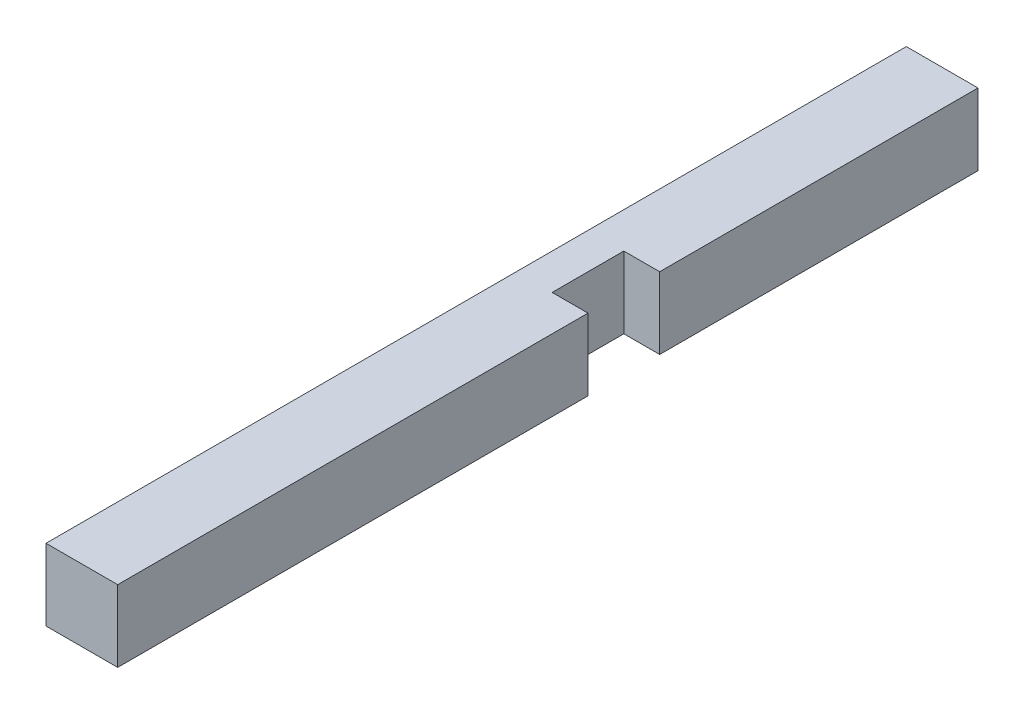
ISO-10303-21;
HEADER;
FILE_DESCRIPTION(('STEP AP214'),'2;1');
FILE_NAME('part.step','',(''),(''),'','','');
FILE_SCHEMA(('AUTOMOTIVE_DESIGN { 1 0 10303 214 1 1 1 1 }'));
ENDSEC;
DATA;
#1=APPLICATION_CONTEXT('core data for automotive mechanical design processes');
#2=APPLICATION_PROTOCOL_DEFINITION('international standard','automotive_design',2000,#1);
#3=PRODUCT_CONTEXT('',#1,'mechanical');
#4=PRODUCT('Part','Part','',(#3));
#5=PRODUCT_RELATED_PRODUCT_CATEGORY('part','',(#4));
#6=PRODUCT_DEFINITION_FORMATION('','',#4);
#7=PRODUCT_DEFINITION_CONTEXT('part definition',#1,'design');
#8=PRODUCT_DEFINITION('design','',#6,#7);
#9=PRODUCT_DEFINITION_SHAPE('','',#8);
#10=(LENGTH_UNIT() NAMED_UNIT(*) SI_UNIT(.MILLI.,.METRE.));
#11=(NAMED_UNIT(*) PLANE_ANGLE_UNIT() SI_UNIT($,.RADIAN.));
#12=(NAMED_UNIT(*) SI_UNIT($,.STERADIAN.) SOLID_ANGLE_UNIT());
#13=UNCERTAINTY_MEASURE_WITH_UNIT(LENGTH_MEASURE(1.E-05),#10,'distance_accuracy_value','');
#14=(GEOMETRIC_REPRESENTATION_CONTEXT(3) GLOBAL_UNCERTAINTY_ASSIGNED_CONTEXT((#13)) GLOBAL_UNIT_ASSIGNED_CONTEXT((#10,
#11,#12)) REPRESENTATION_CONTEXT('',''));
#15=CARTESIAN_POINT('',(0.,0.,0.));
#16=DIRECTION('',(0.,0.,1.));
#17=DIRECTION('',(1.,0.,0.));
#18=AXIS2_PLACEMENT_3D('',#15,#16,#17);
#19=CARTESIAN_POINT('',(10.,0.,120.));
#20=DIRECTION('',(-1.,0.,0.));
#21=DIRECTION('',(0.,0.,1.));
#22=AXIS2_PLACEMENT_3D('',#19,#20,#21);
#23=PLANE('',#22);
#24=DIRECTION('',(0.,0.,-1.));
#25=VECTOR('',#24,1.);
#26=CARTESIAN_POINT('',(10.,0.,120.));
#27=LINE('',#26,#25);
#28=CARTESIAN_POINT('',(10.,0.,120.));
#29=VERTEX_POINT('',#28);
#30=CARTESIAN_POINT('',(10.,0.,54.4));
#31=VERTEX_POINT('',#30);
#32=EDGE_CURVE('E43',#29,#31,#27,.T.);
#33=ORIENTED_EDGE('',*,*,#32,.T.);
#34=DIRECTION('',(0.,1.,0.));
#35=VECTOR('',#34,1.);
#36=CARTESIAN_POINT('',(10.,0.,54.4));
#37=LINE('',#36,#35);
#38=CARTESIAN_POINT('',(10.,10.,54.4));
#39=VERTEX_POINT('',#38);
#40=EDGE_CURVE('E143',#31,#39,#37,.T.);
#41=ORIENTED_EDGE('',*,*,#40,.T.);
#42=DIRECTION('',(0.,0.,-1.));
#43=VECTOR('',#42,1.);
#44=CARTESIAN_POINT('',(10.,10.,120.));
#45=LINE('',#44,#43);
#46=CARTESIAN_POINT('',(10.,10.,120.));
#47=VERTEX_POINT('',#46);
#48=EDGE_CURVE('E128',#47,#39,#45,.T.);
#49=ORIENTED_EDGE('',*,*,#48,.F.);
#50=DIRECTION('',(0.,1.,0.));
#51=VECTOR('',#50,1.);
#52=CARTESIAN_POINT('',(10.,0.,120.));
#53=LINE('',#52,#51);
#54=EDGE_CURVE('E145',#29,#47,#53,.T.);
#55=ORIENTED_EDGE('',*,*,#54,.F.);
#56=EDGE_LOOP('',(#33,#41,#49,#55));
#57=FACE_BOUND('',#56,.T.);
#58=ADVANCED_FACE('F35',(#57),#23,.F.);
#59=CARTESIAN_POINT('',(0.,0.,120.));
#60=DIRECTION('',(1.,0.,0.));
#61=DIRECTION('',(0.,0.,-1.));
#62=AXIS2_PLACEMENT_3D('',#59,#60,#61);
#63=PLANE('',#62);
#64=DIRECTION('',(0.,-1.,0.));
#65=VECTOR('',#64,1.);
#66=CARTESIAN_POINT('',(0.,0.,0.));
#67=LINE('',#66,#65);
#68=CARTESIAN_POINT('',(0.,10.,0.));
#69=VERTEX_POINT('',#68);
#70=CARTESIAN_POINT('',(0.,0.,0.));
#71=VERTEX_POINT('',#70);
#72=EDGE_CURVE('E140',#69,#71,#67,.T.);
#73=ORIENTED_EDGE('',*,*,#72,.T.);
#74=DIRECTION('',(0.,0.,-1.));
#75=VECTOR('',#74,1.);
#76=CARTESIAN_POINT('',(0.,0.,120.));
#77=LINE('',#76,#75);
#78=CARTESIAN_POINT('',(0.,0.,120.));
#79=VERTEX_POINT('',#78);
#80=EDGE_CURVE('E11',#79,#71,#77,.T.);
#81=ORIENTED_EDGE('',*,*,#80,.F.);
#82=DIRECTION('',(0.,-1.,0.));
#83=VECTOR('',#82,1.);
#84=CARTESIAN_POINT('',(0.,0.,120.));
#85=LINE('',#84,#83);
#86=CARTESIAN_POINT('',(0.,10.,120.));
#87=VERTEX_POINT('',#86);
#88=EDGE_CURVE('E136',#87,#79,#85,.T.);
#89=ORIENTED_EDGE('',*,*,#88,.F.);
#90=DIRECTION('',(0.,0.,-1.));
#91=VECTOR('',#90,1.);
#92=CARTESIAN_POINT('',(0.,10.,120.));
#93=LINE('',#92,#91);
#94=EDGE_CURVE('E133',#87,#69,#93,.T.);
#95=ORIENTED_EDGE('',*,*,#94,.T.);
#96=EDGE_LOOP('',(#73,#81,#89,#95));
#97=FACE_BOUND('',#96,.T.);
#98=ADVANCED_FACE('F37',(#97),#63,.F.);
#99=CARTESIAN_POINT('',(0.,0.,120.));
#100=DIRECTION('',(0.,1.,0.));
#101=DIRECTION('',(0.,0.,1.));
#102=AXIS2_PLACEMENT_3D('',#99,#100,#101);
#103=PLANE('',#102);
#104=DIRECTION('',(0.,0.,1.));
#105=VECTOR('',#104,1.);
#106=CARTESIAN_POINT('',(5.,0.,44.4));
#107=LINE('',#106,#105);
#108=CARTESIAN_POINT('',(5.,0.,44.4));
#109=VERTEX_POINT('',#108);
#110=CARTESIAN_POINT('',(5.,0.,54.4));
#111=VERTEX_POINT('',#110);
#112=EDGE_CURVE('E113',#109,#111,#107,.T.);
#113=ORIENTED_EDGE('',*,*,#112,.T.);
#114=DIRECTION('',(1.,0.,0.));
#115=VECTOR('',#114,1.);
#116=CARTESIAN_POINT('',(10.,0.,54.4));
#117=LINE('',#116,#115);
#118=EDGE_CURVE('E123',#111,#31,#117,.T.);
#119=ORIENTED_EDGE('',*,*,#118,.T.);
#120=ORIENTED_EDGE('',*,*,#32,.F.);
#121=DIRECTION('',(1.,0.,0.));
#122=VECTOR('',#121,1.);
#123=CARTESIAN_POINT('',(0.,0.,120.));
#124=LINE('',#123,#122);
#125=EDGE_CURVE('E86',#79,#29,#124,.T.);
#126=ORIENTED_EDGE('',*,*,#125,.F.);
#127=ORIENTED_EDGE('',*,*,#80,.T.);
#128=DIRECTION('',(1.,0.,0.));
#129=VECTOR('',#128,1.);
#130=CARTESIAN_POINT('',(0.,0.,0.));
#131=LINE('',#130,#129);
#132=CARTESIAN_POINT('',(10.,0.,0.));
#133=VERTEX_POINT('',#132);
#134=EDGE_CURVE('E126',#71,#133,#131,.T.);
#135=ORIENTED_EDGE('',*,*,#134,.T.);
#136=CARTESIAN_POINT('',(10.,0.,44.4));
#137=VERTEX_POINT('',#136);
#138=EDGE_CURVE('E120',#137,#133,#27,.T.);
#139=ORIENTED_EDGE('',*,*,#138,.F.);
#140=DIRECTION('',(-1.,0.,0.));
#141=VECTOR('',#140,1.);
#142=CARTESIAN_POINT('',(10.,0.,44.4));
#143=LINE('',#142,#141);
#144=EDGE_CURVE('E107',#137,#109,#143,.T.);
#145=ORIENTED_EDGE('',*,*,#144,.T.);
#146=EDGE_LOOP('',(#113,#119,#120,#126,#127,#135,#139,#145));
#147=FACE_BOUND('',#146,.T.);
#148=ADVANCED_FACE('F125',(#147),#103,.F.);
#149=CARTESIAN_POINT('',(10.,10.,44.4));
#150=VERTEX_POINT('',#149);
#151=CARTESIAN_POINT('',(10.,10.,0.));
#152=VERTEX_POINT('',#151);
#153=EDGE_CURVE('E122',#150,#152,#45,.T.);
#154=ORIENTED_EDGE('',*,*,#153,.F.);
#155=DIRECTION('',(0.,1.,0.));
#156=VECTOR('',#155,1.);
#157=CARTESIAN_POINT('',(10.,0.,44.4));
#158=LINE('',#157,#156);
#159=EDGE_CURVE('E50',#137,#150,#158,.T.);
#160=ORIENTED_EDGE('',*,*,#159,.F.);
#161=ORIENTED_EDGE('',*,*,#138,.T.);
#162=DIRECTION('',(0.,1.,0.));
#163=VECTOR('',#162,1.);
#164=CARTESIAN_POINT('',(10.,0.,0.));
#165=LINE('',#164,#163);
#166=EDGE_CURVE('E137',#133,#152,#165,.T.);
#167=ORIENTED_EDGE('',*,*,#166,.T.);
#168=EDGE_LOOP('',(#154,#160,#161,#167));
#169=FACE_BOUND('',#168,.T.);
#170=ADVANCED_FACE('F118',(#169),#23,.F.);
#171=CARTESIAN_POINT('',(0.,10.,120.));
#172=DIRECTION('',(0.,-1.,0.));
#173=DIRECTION('',(0.,0.,-1.));
#174=AXIS2_PLACEMENT_3D('',#171,#172,#173);
#175=PLANE('',#174);
#176=ORIENTED_EDGE('',*,*,#48,.T.);
#177=DIRECTION('',(1.,0.,0.));
#178=VECTOR('',#177,1.);
#179=CARTESIAN_POINT('',(10.,10.,54.4));
#180=LINE('',#179,#178);
#181=CARTESIAN_POINT('',(5.,10.,54.4));
#182=VERTEX_POINT('',#181);
#183=EDGE_CURVE('E114',#182,#39,#180,.T.);
#184=ORIENTED_EDGE('',*,*,#183,.F.);
#185=DIRECTION('',(0.,0.,1.));
#186=VECTOR('',#185,1.);
#187=CARTESIAN_POINT('',(5.,10.,44.4));
#188=LINE('',#187,#186);
#189=CARTESIAN_POINT('',(5.,10.,44.4));
#190=VERTEX_POINT('',#189);
#191=EDGE_CURVE('E155',#190,#182,#188,.T.);
#192=ORIENTED_EDGE('',*,*,#191,.F.);
#193=DIRECTION('',(-1.,0.,0.));
#194=VECTOR('',#193,1.);
#195=CARTESIAN_POINT('',(10.,10.,44.4));
#196=LINE('',#195,#194);
#197=EDGE_CURVE('E158',#150,#190,#196,.T.);
#198=ORIENTED_EDGE('',*,*,#197,.F.);
#199=ORIENTED_EDGE('',*,*,#153,.T.);
#200=DIRECTION('',(-1.,0.,0.));
#201=VECTOR('',#200,1.);
#202=CARTESIAN_POINT('',(0.,10.,0.));
#203=LINE('',#202,#201);
#204=EDGE_CURVE('E79',#152,#69,#203,.T.);
#205=ORIENTED_EDGE('',*,*,#204,.T.);
#206=ORIENTED_EDGE('',*,*,#94,.F.);
#207=DIRECTION('',(-1.,0.,0.));
#208=VECTOR('',#207,1.);
#209=CARTESIAN_POINT('',(0.,10.,120.));
#210=LINE('',#209,#208);
#211=EDGE_CURVE('E59',#47,#87,#210,.T.);
#212=ORIENTED_EDGE('',*,*,#211,.F.);
#213=EDGE_LOOP('',(#176,#184,#192,#198,#199,#205,#206,#212));
#214=FACE_BOUND('',#213,.T.);
#215=ADVANCED_FACE('F172',(#214),#175,.F.);
#216=CARTESIAN_POINT('',(0.,0.,120.));
#217=DIRECTION('',(0.,0.,-1.));
#218=DIRECTION('',(-1.,0.,0.));
#219=AXIS2_PLACEMENT_3D('',#216,#217,#218);
#220=PLANE('',#219);
#221=ORIENTED_EDGE('',*,*,#88,.T.);
#222=ORIENTED_EDGE('',*,*,#125,.T.);
#223=ORIENTED_EDGE('',*,*,#54,.T.);
#224=ORIENTED_EDGE('',*,*,#211,.T.);
#225=EDGE_LOOP('',(#221,#222,#223,#224));
#226=FACE_BOUND('',#225,.T.);
#227=ADVANCED_FACE('F177',(#226),#220,.F.);
#228=CARTESIAN_POINT('',(0.,0.,0.));
#229=DIRECTION('',(0.,0.,-1.));
#230=DIRECTION('',(-1.,0.,0.));
#231=AXIS2_PLACEMENT_3D('',#228,#229,#230);
#232=PLANE('',#231);
#233=ORIENTED_EDGE('',*,*,#72,.F.);
#234=ORIENTED_EDGE('',*,*,#204,.F.);
#235=ORIENTED_EDGE('',*,*,#166,.F.);
#236=ORIENTED_EDGE('',*,*,#134,.F.);
#237=EDGE_LOOP('',(#233,#234,#235,#236));
#238=FACE_BOUND('',#237,.T.);
#239=ADVANCED_FACE('F179',(#238),#232,.T.);
#240=CARTESIAN_POINT('',(10.,0.,54.4));
#241=DIRECTION('',(0.,0.,1.));
#242=DIRECTION('',(1.,0.,0.));
#243=AXIS2_PLACEMENT_3D('',#240,#241,#242);
#244=PLANE('',#243);
#245=ORIENTED_EDGE('',*,*,#183,.T.);
#246=ORIENTED_EDGE('',*,*,#40,.F.);
#247=ORIENTED_EDGE('',*,*,#118,.F.);
#248=DIRECTION('',(0.,1.,0.));
#249=VECTOR('',#248,1.);
#250=CARTESIAN_POINT('',(5.,0.,54.4));
#251=LINE('',#250,#249);
#252=EDGE_CURVE('E150',#111,#182,#251,.T.);
#253=ORIENTED_EDGE('',*,*,#252,.T.);
#254=EDGE_LOOP('',(#245,#246,#247,#253));
#255=FACE_BOUND('',#254,.T.);
#256=ADVANCED_FACE('F168',(#255),#244,.F.);
#257=CARTESIAN_POINT('',(5.,0.,44.4));
#258=DIRECTION('',(-1.,0.,0.));
#259=DIRECTION('',(0.,0.,1.));
#260=AXIS2_PLACEMENT_3D('',#257,#258,#259);
#261=PLANE('',#260);
#262=ORIENTED_EDGE('',*,*,#191,.T.);
#263=ORIENTED_EDGE('',*,*,#252,.F.);
#264=ORIENTED_EDGE('',*,*,#112,.F.);
#265=DIRECTION('',(0.,1.,0.));
#266=VECTOR('',#265,1.);
#267=CARTESIAN_POINT('',(5.,0.,44.4));
#268=LINE('',#267,#266);
#269=EDGE_CURVE('E109',#109,#190,#268,.T.);
#270=ORIENTED_EDGE('',*,*,#269,.T.);
#271=EDGE_LOOP('',(#262,#263,#264,#270));
#272=FACE_BOUND('',#271,.T.);
#273=ADVANCED_FACE('F164',(#272),#261,.F.);
#274=CARTESIAN_POINT('',(10.,0.,44.4));
#275=DIRECTION('',(0.,0.,-1.));
#276=DIRECTION('',(-1.,0.,0.));
#277=AXIS2_PLACEMENT_3D('',#274,#275,#276);
#278=PLANE('',#277);
#279=ORIENTED_EDGE('',*,*,#197,.T.);
#280=ORIENTED_EDGE('',*,*,#269,.F.);
#281=ORIENTED_EDGE('',*,*,#144,.F.);
#282=ORIENTED_EDGE('',*,*,#159,.T.);
#283=EDGE_LOOP('',(#279,#280,#281,#282));
#284=FACE_BOUND('',#283,.T.);
#285=ADVANCED_FACE('F108',(#284),#278,.F.);
#286=CLOSED_SHELL('',(#58,#98,#148,#170,#215,#227,#239,#256,#273,#285));
#287=MANIFOLD_SOLID_BREP('B2',#286);
#288=ADVANCED_BREP_SHAPE_REPRESENTATION('',(#18,#287),#14);
#289=SHAPE_DEFINITION_REPRESENTATION(#9,#288);
ENDSEC;
END-ISO-10303-21;
